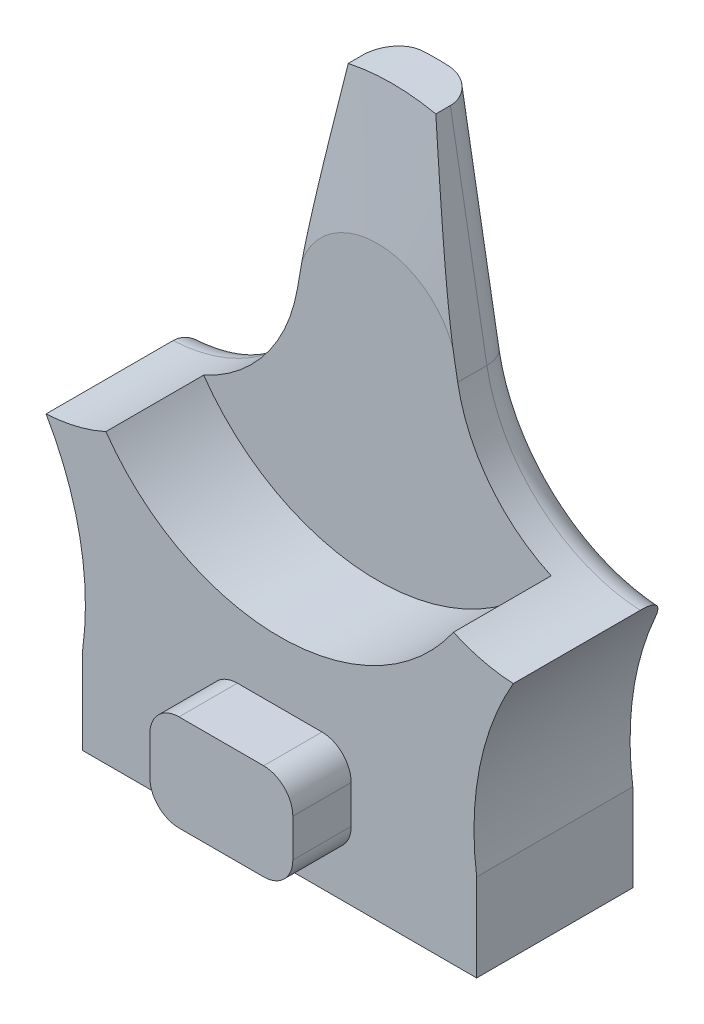
ISO-10303-21;
HEADER;
FILE_DESCRIPTION(('STEP AP214'),'2;1');
FILE_NAME('part.step','',(''),(''),'','','');
FILE_SCHEMA(('AUTOMOTIVE_DESIGN { 1 0 10303 214 1 1 1 1 }'));
ENDSEC;
DATA;
#1=APPLICATION_CONTEXT('core data for automotive mechanical design processes');
#2=APPLICATION_PROTOCOL_DEFINITION('international standard','automotive_design',2000,#1);
#3=PRODUCT_CONTEXT('',#1,'mechanical');
#4=PRODUCT('Part','Part','',(#3));
#5=PRODUCT_RELATED_PRODUCT_CATEGORY('part','',(#4));
#6=PRODUCT_DEFINITION_FORMATION('','',#4);
#7=PRODUCT_DEFINITION_CONTEXT('part definition',#1,'design');
#8=PRODUCT_DEFINITION('design','',#6,#7);
#9=PRODUCT_DEFINITION_SHAPE('','',#8);
#10=(LENGTH_UNIT() NAMED_UNIT(*) SI_UNIT(.MILLI.,.METRE.));
#11=(NAMED_UNIT(*) PLANE_ANGLE_UNIT() SI_UNIT($,.RADIAN.));
#12=(NAMED_UNIT(*) SI_UNIT($,.STERADIAN.) SOLID_ANGLE_UNIT());
#13=UNCERTAINTY_MEASURE_WITH_UNIT(LENGTH_MEASURE(1.E-05),#10,'distance_accuracy_value','');
#14=(GEOMETRIC_REPRESENTATION_CONTEXT(3) GLOBAL_UNCERTAINTY_ASSIGNED_CONTEXT((#13)) GLOBAL_UNIT_ASSIGNED_CONTEXT((#10,
#11,#12)) REPRESENTATION_CONTEXT('',''));
#15=CARTESIAN_POINT('',(0.,0.,0.));
#16=DIRECTION('',(0.,0.,1.));
#17=DIRECTION('',(1.,0.,0.));
#18=AXIS2_PLACEMENT_3D('',#15,#16,#17);
#19=CARTESIAN_POINT('',(5.95456315633577,-4.13590106472685,0.));
#20=DIRECTION('',(0.,0.,-1.));
#21=DIRECTION('',(-1.,0.,0.));
#22=AXIS2_PLACEMENT_3D('',#19,#20,#21);
#23=PLANE('',#22);
#24=CARTESIAN_POINT('',(-8.28795351713206,0.980518828013158,0.));
#25=DIRECTION('',(0.,0.,1.));
#26=DIRECTION('',(1.,0.,0.));
#27=AXIS2_PLACEMENT_3D('',#24,#25,#26);
#28=CIRCLE('',#27,5.62338537668215);
#29=CARTESIAN_POINT('',(-8.00453626127346,-4.63571992704029,0.));
#30=VERTEX_POINT('',#29);
#31=CARTESIAN_POINT('',(-5.95456315633577,-4.13590106472685,0.));
#32=VERTEX_POINT('',#31);
#33=EDGE_CURVE('E207',#30,#32,#28,.T.);
#34=ORIENTED_EDGE('',*,*,#33,.F.);
#35=CARTESIAN_POINT('',(-16.6580889761637,-9.64730903735411,0.));
#36=DIRECTION('',(0.,0.,-1.));
#37=DIRECTION('',(-1.,0.,0.));
#38=AXIS2_PLACEMENT_3D('',#35,#36,#37);
#39=CIRCLE('',#38,10.);
#40=CARTESIAN_POINT('',(-6.75,-11.,0.));
#41=VERTEX_POINT('',#40);
#42=EDGE_CURVE('E422',#41,#30,#39,.F.);
#43=ORIENTED_EDGE('',*,*,#42,.F.);
#44=DIRECTION('',(0.,1.,0.));
#45=VECTOR('',#44,1.);
#46=CARTESIAN_POINT('',(-6.75000000000001,-14.,0.));
#47=LINE('',#46,#45);
#48=CARTESIAN_POINT('',(-6.75000000000001,-14.,0.));
#49=VERTEX_POINT('',#48);
#50=EDGE_CURVE('E425',#49,#41,#47,.T.);
#51=ORIENTED_EDGE('',*,*,#50,.F.);
#52=DIRECTION('',(-1.,0.,0.));
#53=VECTOR('',#52,1.);
#54=CARTESIAN_POINT('',(6.75,-14.,0.));
#55=LINE('',#54,#53);
#56=CARTESIAN_POINT('',(6.75,-14.,0.));
#57=VERTEX_POINT('',#56);
#58=EDGE_CURVE('E416',#57,#49,#55,.T.);
#59=ORIENTED_EDGE('',*,*,#58,.F.);
#60=DIRECTION('',(0.,-1.,0.));
#61=VECTOR('',#60,1.);
#62=CARTESIAN_POINT('',(6.75,-11.,0.));
#63=LINE('',#62,#61);
#64=CARTESIAN_POINT('',(6.75,-11.,0.));
#65=VERTEX_POINT('',#64);
#66=EDGE_CURVE('E213',#65,#57,#63,.T.);
#67=ORIENTED_EDGE('',*,*,#66,.F.);
#68=CARTESIAN_POINT('',(16.6580889761637,-9.64730903735411,0.));
#69=DIRECTION('',(0.,0.,-1.));
#70=DIRECTION('',(-1.,0.,0.));
#71=AXIS2_PLACEMENT_3D('',#68,#69,#70);
#72=CIRCLE('',#71,10.);
#73=CARTESIAN_POINT('',(8.00453626127346,-4.63571992704029,0.));
#74=VERTEX_POINT('',#73);
#75=EDGE_CURVE('E210',#74,#65,#72,.F.);
#76=ORIENTED_EDGE('',*,*,#75,.F.);
#77=CARTESIAN_POINT('',(8.28795351713206,0.980518828013156,0.));
#78=DIRECTION('',(0.,0.,1.));
#79=DIRECTION('',(-1.,0.,0.));
#80=AXIS2_PLACEMENT_3D('',#77,#78,#79);
#81=CIRCLE('',#80,5.62338537668215);
#82=CARTESIAN_POINT('',(5.95456315633577,-4.13590106472685,0.));
#83=VERTEX_POINT('',#82);
#84=EDGE_CURVE('E198',#83,#74,#81,.T.);
#85=ORIENTED_EDGE('',*,*,#84,.F.);
#86=CARTESIAN_POINT('',(0.,0.,0.));
#87=DIRECTION('',(0.,0.,-1.));
#88=DIRECTION('',(-1.,0.,0.));
#89=AXIS2_PLACEMENT_3D('',#86,#87,#88);
#90=CIRCLE('',#89,7.25);
#91=EDGE_CURVE('E462',#32,#83,#90,.F.);
#92=ORIENTED_EDGE('',*,*,#91,.F.);
#93=EDGE_LOOP('',(#34,#43,#51,#59,#67,#76,#85,#92));
#94=FACE_BOUND('',#93,.T.);
#95=DIRECTION('',(0.,1.,0.));
#96=VECTOR('',#95,1.);
#97=CARTESIAN_POINT('',(2.45,-9.35,0.));
#98=LINE('',#97,#96);
#99=CARTESIAN_POINT('',(2.45,-11.65,0.));
#100=VERTEX_POINT('',#99);
#101=CARTESIAN_POINT('',(2.45,-10.35,0.));
#102=VERTEX_POINT('',#101);
#103=EDGE_CURVE('E504',#100,#102,#98,.T.);
#104=ORIENTED_EDGE('',*,*,#103,.F.);
#105=CARTESIAN_POINT('',(1.45,-11.65,0.));
#106=DIRECTION('',(0.,0.,-1.));
#107=DIRECTION('',(-1.,0.,0.));
#108=AXIS2_PLACEMENT_3D('',#105,#106,#107);
#109=CIRCLE('',#108,1.);
#110=CARTESIAN_POINT('',(1.45,-12.65,0.));
#111=VERTEX_POINT('',#110);
#112=EDGE_CURVE('E494',#100,#111,#109,.T.);
#113=ORIENTED_EDGE('',*,*,#112,.T.);
#114=DIRECTION('',(1.,0.,0.));
#115=VECTOR('',#114,1.);
#116=CARTESIAN_POINT('',(-2.45,-12.65,0.));
#117=LINE('',#116,#115);
#118=CARTESIAN_POINT('',(-1.45,-12.65,0.));
#119=VERTEX_POINT('',#118);
#120=EDGE_CURVE('E525',#119,#111,#117,.T.);
#121=ORIENTED_EDGE('',*,*,#120,.F.);
#122=CARTESIAN_POINT('',(-1.45,-11.65,0.));
#123=DIRECTION('',(0.,0.,-1.));
#124=DIRECTION('',(-1.,0.,0.));
#125=AXIS2_PLACEMENT_3D('',#122,#123,#124);
#126=CIRCLE('',#125,1.);
#127=CARTESIAN_POINT('',(-2.45,-11.65,0.));
#128=VERTEX_POINT('',#127);
#129=EDGE_CURVE('E11',#119,#128,#126,.T.);
#130=ORIENTED_EDGE('',*,*,#129,.T.);
#131=DIRECTION('',(0.,-1.,0.));
#132=VECTOR('',#131,1.);
#133=CARTESIAN_POINT('',(-2.45,-9.35,0.));
#134=LINE('',#133,#132);
#135=CARTESIAN_POINT('',(-2.45,-10.35,0.));
#136=VERTEX_POINT('',#135);
#137=EDGE_CURVE('E499',#136,#128,#134,.T.);
#138=ORIENTED_EDGE('',*,*,#137,.F.);
#139=CARTESIAN_POINT('',(-1.45,-10.35,0.));
#140=DIRECTION('',(0.,0.,-1.));
#141=DIRECTION('',(-1.,0.,0.));
#142=AXIS2_PLACEMENT_3D('',#139,#140,#141);
#143=CIRCLE('',#142,1.);
#144=CARTESIAN_POINT('',(-1.45,-9.35,0.));
#145=VERTEX_POINT('',#144);
#146=EDGE_CURVE('E45',#136,#145,#143,.T.);
#147=ORIENTED_EDGE('',*,*,#146,.T.);
#148=DIRECTION('',(-1.,0.,0.));
#149=VECTOR('',#148,1.);
#150=CARTESIAN_POINT('',(-2.45,-9.35,0.));
#151=LINE('',#150,#149);
#152=CARTESIAN_POINT('',(1.45,-9.35,0.));
#153=VERTEX_POINT('',#152);
#154=EDGE_CURVE('E498',#153,#145,#151,.T.);
#155=ORIENTED_EDGE('',*,*,#154,.F.);
#156=CARTESIAN_POINT('',(1.45,-10.35,0.));
#157=DIRECTION('',(0.,0.,-1.));
#158=DIRECTION('',(-1.,0.,0.));
#159=AXIS2_PLACEMENT_3D('',#156,#157,#158);
#160=CIRCLE('',#159,1.);
#161=EDGE_CURVE('E492',#153,#102,#160,.T.);
#162=ORIENTED_EDGE('',*,*,#161,.T.);
#163=EDGE_LOOP('',(#104,#113,#121,#130,#138,#147,#155,#162));
#164=FACE_BOUND('',#163,.T.);
#165=ADVANCED_FACE('F37',(#94,#164),#23,.F.);
#166=CARTESIAN_POINT('',(8.28795351713206,0.980518828013156,-3.35));
#167=DIRECTION('',(0.,0.,1.));
#168=DIRECTION('',(1.,0.,0.));
#169=AXIS2_PLACEMENT_3D('',#166,#167,#168);
#170=PLANE('',#169);
#171=CARTESIAN_POINT('',(-8.28795351713206,0.980518828013158,-3.35));
#172=DIRECTION('',(0.,0.,1.));
#173=DIRECTION('',(-1.,0.,0.));
#174=AXIS2_PLACEMENT_3D('',#171,#172,#173);
#175=CIRCLE('',#174,5.62338537668215);
#176=CARTESIAN_POINT('',(-5.95456315633577,-4.13590106472685,-3.35));
#177=VERTEX_POINT('',#176);
#178=CARTESIAN_POINT('',(-2.75,0.00402820503343662,-3.35));
#179=VERTEX_POINT('',#178);
#180=EDGE_CURVE('E391',#177,#179,#175,.T.);
#181=ORIENTED_EDGE('',*,*,#180,.F.);
#182=CARTESIAN_POINT('',(0.,0.,-3.35));
#183=DIRECTION('',(0.,0.,1.));
#184=DIRECTION('',(1.,0.,0.));
#185=AXIS2_PLACEMENT_3D('',#182,#183,#184);
#186=CIRCLE('',#185,7.25);
#187=CARTESIAN_POINT('',(5.95456315633577,-4.13590106472685,-3.35));
#188=VERTEX_POINT('',#187);
#189=EDGE_CURVE('E433',#188,#177,#186,.F.);
#190=ORIENTED_EDGE('',*,*,#189,.F.);
#191=CARTESIAN_POINT('',(8.28795351713206,0.980518828013156,-3.35));
#192=DIRECTION('',(0.,0.,1.));
#193=DIRECTION('',(1.,0.,0.));
#194=AXIS2_PLACEMENT_3D('',#191,#192,#193);
#195=CIRCLE('',#194,5.62338537668215);
#196=CARTESIAN_POINT('',(2.75,0.00402820503343435,-3.35));
#197=VERTEX_POINT('',#196);
#198=EDGE_CURVE('E449',#197,#188,#195,.T.);
#199=ORIENTED_EDGE('',*,*,#198,.F.);
#200=DIRECTION('',(0.173648177666931,-0.984807753012208,0.));
#201=VECTOR('',#200,1.);
#202=CARTESIAN_POINT('',(1.5,7.09313047955555,-3.35));
#203=LINE('',#202,#201);
#204=CARTESIAN_POINT('',(2.58553540945316,0.936753247372591,-3.35));
#205=VERTEX_POINT('',#204);
#206=EDGE_CURVE('E386',#205,#197,#203,.T.);
#207=ORIENTED_EDGE('',*,*,#206,.F.);
#208=CARTESIAN_POINT('',(0.,0.,-3.35));
#209=DIRECTION('',(0.,0.,1.));
#210=DIRECTION('',(1.,0.,0.));
#211=AXIS2_PLACEMENT_3D('',#208,#209,#210);
#212=CIRCLE('',#211,2.74999999999986);
#213=CARTESIAN_POINT('',(-2.58553540945316,0.936753247372578,-3.35));
#214=VERTEX_POINT('',#213);
#215=EDGE_CURVE('E239',#205,#214,#212,.T.);
#216=ORIENTED_EDGE('',*,*,#215,.T.);
#217=DIRECTION('',(0.173648177666931,0.984807753012208,0.));
#218=VECTOR('',#217,1.);
#219=CARTESIAN_POINT('',(-1.5,7.09313047955555,-3.35));
#220=LINE('',#219,#218);
#221=EDGE_CURVE('E383',#179,#214,#220,.T.);
#222=ORIENTED_EDGE('',*,*,#221,.F.);
#223=EDGE_LOOP('',(#181,#190,#199,#207,#216,#222));
#224=FACE_BOUND('',#223,.T.);
#225=ADVANCED_FACE('F253',(#224),#170,.T.);
#226=CARTESIAN_POINT('',(8.28795351713206,0.980518828013156,-5.35));
#227=DIRECTION('',(0.,0.,1.));
#228=DIRECTION('',(1.,0.,0.));
#229=AXIS2_PLACEMENT_3D('',#226,#227,#228);
#230=CYLINDRICAL_SURFACE('',#229,5.62338537668215);
#231=DIRECTION('',(0.,0.,1.));
#232=VECTOR('',#231,1.);
#233=CARTESIAN_POINT('',(8.00453626127346,-4.63571992704029,-5.35));
#234=LINE('',#233,#232);
#235=CARTESIAN_POINT('',(8.00453626127346,-4.63571992704029,-4.35));
#236=VERTEX_POINT('',#235);
#237=EDGE_CURVE('E202',#236,#74,#234,.T.);
#238=ORIENTED_EDGE('',*,*,#237,.F.);
#239=CARTESIAN_POINT('',(8.28795351713206,0.980518828013156,-4.35));
#240=DIRECTION('',(0.,0.,1.));
#241=DIRECTION('',(1.,0.,0.));
#242=AXIS2_PLACEMENT_3D('',#239,#240,#241);
#243=CIRCLE('',#242,5.62338537668215);
#244=CARTESIAN_POINT('',(2.75,0.00402820503343435,-4.35));
#245=VERTEX_POINT('',#244);
#246=EDGE_CURVE('E297',#236,#245,#243,.F.);
#247=ORIENTED_EDGE('',*,*,#246,.T.);
#248=DIRECTION('',(0.,0.,1.));
#249=VECTOR('',#248,1.);
#250=CARTESIAN_POINT('',(2.75,0.00402820503343435,-5.35));
#251=LINE('',#250,#249);
#252=EDGE_CURVE('E354',#245,#197,#251,.T.);
#253=ORIENTED_EDGE('',*,*,#252,.T.);
#254=ORIENTED_EDGE('',*,*,#198,.T.);
#255=DIRECTION('',(0.,0.,1.));
#256=VECTOR('',#255,1.);
#257=CARTESIAN_POINT('',(5.95456315633577,-4.13590106472685,-22.1540115623508));
#258=LINE('',#257,#256);
#259=EDGE_CURVE('E205',#188,#83,#258,.T.);
#260=ORIENTED_EDGE('',*,*,#259,.T.);
#261=ORIENTED_EDGE('',*,*,#84,.T.);
#262=EDGE_LOOP('',(#238,#247,#253,#254,#260,#261));
#263=FACE_BOUND('',#262,.T.);
#264=ADVANCED_FACE('F200',(#263),#230,.F.);
#265=CARTESIAN_POINT('',(16.6580889761637,-9.64730903735411,-5.35));
#266=DIRECTION('',(0.,0.,1.));
#267=DIRECTION('',(1.,0.,0.));
#268=AXIS2_PLACEMENT_3D('',#265,#266,#267);
#269=CYLINDRICAL_SURFACE('',#268,10.);
#270=ORIENTED_EDGE('',*,*,#237,.T.);
#271=ORIENTED_EDGE('',*,*,#75,.T.);
#272=DIRECTION('',(0.,0.,1.));
#273=VECTOR('',#272,1.);
#274=CARTESIAN_POINT('',(6.75,-11.,-5.35));
#275=LINE('',#274,#273);
#276=CARTESIAN_POINT('',(6.75,-11.,-5.35));
#277=VERTEX_POINT('',#276);
#278=EDGE_CURVE('E224',#277,#65,#275,.T.);
#279=ORIENTED_EDGE('',*,*,#278,.F.);
#280=CARTESIAN_POINT('',(16.6580889761637,-9.64730903735411,-5.35));
#281=DIRECTION('',(0.,0.,1.));
#282=DIRECTION('',(-1.,0.,0.));
#283=AXIS2_PLACEMENT_3D('',#280,#281,#282);
#284=CIRCLE('',#283,10.);
#285=CARTESIAN_POINT('',(7.51479933973998,-5.59758625369755,-5.35));
#286=VERTEX_POINT('',#285);
#287=EDGE_CURVE('E441',#286,#277,#284,.T.);
#288=ORIENTED_EDGE('',*,*,#287,.F.);
#289=CARTESIAN_POINT('',(7.51479933973998,-5.59758625369755,-5.35));
#290=CARTESIAN_POINT('',(7.54022716452608,-5.54012191831414,-5.35003053324127));
#291=CARTESIAN_POINT('',(7.56621607815371,-5.48296077839916,-5.34459620255802));
#292=CARTESIAN_POINT('',(7.61845289958684,-5.37078160024852,-5.32333948378299));
#293=CARTESIAN_POINT('',(7.64470055949943,-5.31576172133951,-5.30752623634775));
#294=CARTESIAN_POINT('',(7.69663144250522,-5.20931172203515,-5.26605786098633));
#295=CARTESIAN_POINT('',(7.72231483550598,-5.15788051061067,-5.24040573982579));
#296=CARTESIAN_POINT('',(7.77221525389835,-5.05990620895944,-5.17992405769295));
#297=CARTESIAN_POINT('',(7.79643190586038,-5.01336436135889,-5.14509217154799));
#298=CARTESIAN_POINT('',(7.84255065265496,-4.92621425936311,-5.0667462808639));
#299=CARTESIAN_POINT('',(7.86443590144804,-4.88564847388685,-5.02317488806157));
#300=CARTESIAN_POINT('',(7.90457731363263,-4.81225090669501,-4.92845238616487));
#301=CARTESIAN_POINT('',(7.92283404547694,-4.779417913391,-4.87730246653703));
#302=CARTESIAN_POINT('',(7.95354507703231,-4.72472416697454,-4.77215082629554));
#303=CARTESIAN_POINT('',(7.9662891169956,-4.70230901670014,-4.71852297525032));
#304=CARTESIAN_POINT('',(7.98659985448402,-4.6667765421437,-4.60740112703006));
#305=CARTESIAN_POINT('',(7.99417878836557,-4.65363724031045,-4.54991662415363));
#306=CARTESIAN_POINT('',(8.00075197178131,-4.64225896677644,-4.46816804560544));
#307=CARTESIAN_POINT('',(8.00216937435166,-4.6398086569338,-4.44461184644839));
#308=CARTESIAN_POINT('',(8.00406101401724,-4.63654033676122,-4.39737513395148));
#309=CARTESIAN_POINT('',(8.00453629305024,-4.63572052318708,-4.37369478701749));
#310=CARTESIAN_POINT('',(8.00453626127346,-4.63571992704029,-4.35));
#311=B_SPLINE_CURVE_WITH_KNOTS('',3,(#289,#290,#291,#292,#293,#294,#295,#296,#297,#298,#299,
#300,#301,#302,#303,#304,#305,#306,#307,#308,#309,#310),.UNSPECIFIED.,.F.,.F.,(4,2,2,2,2,2,2,2,
2,2,4),(0.,0.188209246705387,0.376252960545998,0.564239253844848,0.752273208646291,
0.941584889158994,1.13086688819894,1.30840439661612,1.48551983526486,1.55663554634912,
1.62767256331688),.UNSPECIFIED.);
#312=EDGE_CURVE('E222',#286,#236,#311,.T.);
#313=ORIENTED_EDGE('',*,*,#312,.T.);
#314=EDGE_LOOP('',(#270,#271,#279,#288,#313));
#315=FACE_BOUND('',#314,.T.);
#316=ADVANCED_FACE('F219',(#315),#269,.F.);
#317=CARTESIAN_POINT('',(6.75,-11.,-5.35));
#318=DIRECTION('',(-1.,0.,0.));
#319=DIRECTION('',(0.,0.,1.));
#320=AXIS2_PLACEMENT_3D('',#317,#318,#319);
#321=PLANE('',#320);
#322=ORIENTED_EDGE('',*,*,#278,.T.);
#323=ORIENTED_EDGE('',*,*,#66,.T.);
#324=DIRECTION('',(0.,0.,1.));
#325=VECTOR('',#324,1.);
#326=CARTESIAN_POINT('',(6.75,-14.,-5.35));
#327=LINE('',#326,#325);
#328=CARTESIAN_POINT('',(6.75,-14.,-5.35));
#329=VERTEX_POINT('',#328);
#330=EDGE_CURVE('E229',#329,#57,#327,.T.);
#331=ORIENTED_EDGE('',*,*,#330,.F.);
#332=DIRECTION('',(0.,-1.,0.));
#333=VECTOR('',#332,1.);
#334=CARTESIAN_POINT('',(6.75,-11.,-5.35));
#335=LINE('',#334,#333);
#336=EDGE_CURVE('E421',#277,#329,#335,.T.);
#337=ORIENTED_EDGE('',*,*,#336,.F.);
#338=EDGE_LOOP('',(#322,#323,#331,#337));
#339=FACE_BOUND('',#338,.T.);
#340=ADVANCED_FACE('F307',(#339),#321,.F.);
#341=CARTESIAN_POINT('',(6.75,-14.,-5.35));
#342=DIRECTION('',(0.,1.,0.));
#343=DIRECTION('',(-1.,0.,0.));
#344=AXIS2_PLACEMENT_3D('',#341,#342,#343);
#345=PLANE('',#344);
#346=ORIENTED_EDGE('',*,*,#58,.T.);
#347=DIRECTION('',(0.,0.,1.));
#348=VECTOR('',#347,1.);
#349=CARTESIAN_POINT('',(-6.75000000000001,-14.,-5.35));
#350=LINE('',#349,#348);
#351=CARTESIAN_POINT('',(-6.75000000000001,-14.,-5.35));
#352=VERTEX_POINT('',#351);
#353=EDGE_CURVE('E408',#352,#49,#350,.T.);
#354=ORIENTED_EDGE('',*,*,#353,.F.);
#355=DIRECTION('',(-1.,0.,0.));
#356=VECTOR('',#355,1.);
#357=CARTESIAN_POINT('',(6.75,-14.,-5.35));
#358=LINE('',#357,#356);
#359=EDGE_CURVE('E418',#329,#352,#358,.T.);
#360=ORIENTED_EDGE('',*,*,#359,.F.);
#361=ORIENTED_EDGE('',*,*,#330,.T.);
#362=EDGE_LOOP('',(#346,#354,#360,#361));
#363=FACE_BOUND('',#362,.T.);
#364=ADVANCED_FACE('F414',(#363),#345,.F.);
#365=CARTESIAN_POINT('',(-6.75000000000001,-11.,-5.35));
#366=DIRECTION('',(1.,0.,0.));
#367=DIRECTION('',(0.,0.,-1.));
#368=AXIS2_PLACEMENT_3D('',#365,#366,#367);
#369=PLANE('',#368);
#370=ORIENTED_EDGE('',*,*,#353,.T.);
#371=ORIENTED_EDGE('',*,*,#50,.T.);
#372=DIRECTION('',(0.,0.,1.));
#373=VECTOR('',#372,1.);
#374=CARTESIAN_POINT('',(-6.75000000000001,-11.,-5.35));
#375=LINE('',#374,#373);
#376=CARTESIAN_POINT('',(-6.75000000000001,-11.,-5.35));
#377=VERTEX_POINT('',#376);
#378=EDGE_CURVE('E405',#377,#41,#375,.T.);
#379=ORIENTED_EDGE('',*,*,#378,.F.);
#380=DIRECTION('',(0.,1.,0.));
#381=VECTOR('',#380,1.);
#382=CARTESIAN_POINT('',(-6.75000000000001,-11.,-5.35));
#383=LINE('',#382,#381);
#384=EDGE_CURVE('E445',#352,#377,#383,.T.);
#385=ORIENTED_EDGE('',*,*,#384,.F.);
#386=EDGE_LOOP('',(#370,#371,#379,#385));
#387=FACE_BOUND('',#386,.T.);
#388=ADVANCED_FACE('F695',(#387),#369,.F.);
#389=CARTESIAN_POINT('',(-16.6580889761637,-9.64730903735411,-5.35));
#390=DIRECTION('',(0.,0.,1.));
#391=DIRECTION('',(1.,0.,0.));
#392=AXIS2_PLACEMENT_3D('',#389,#390,#391);
#393=CYLINDRICAL_SURFACE('',#392,10.);
#394=ORIENTED_EDGE('',*,*,#378,.T.);
#395=ORIENTED_EDGE('',*,*,#42,.T.);
#396=DIRECTION('',(0.,0.,1.));
#397=VECTOR('',#396,1.);
#398=CARTESIAN_POINT('',(-8.00453626127346,-4.63571992704029,-5.35));
#399=LINE('',#398,#397);
#400=CARTESIAN_POINT('',(-8.00453626127346,-4.63571992704029,-4.35));
#401=VERTEX_POINT('',#400);
#402=EDGE_CURVE('E398',#401,#30,#399,.T.);
#403=ORIENTED_EDGE('',*,*,#402,.F.);
#404=CARTESIAN_POINT('',(-8.00453626127346,-4.63571992704029,-4.35));
#405=CARTESIAN_POINT('',(-8.00453792682807,-4.63571836511069,-4.37616651670688));
#406=CARTESIAN_POINT('',(-8.00395713378718,-4.63671978470011,-4.4023192376121));
#407=CARTESIAN_POINT('',(-8.00165161655391,-4.64070337794556,-4.45441318401899));
#408=CARTESIAN_POINT('',(-7.99992731218761,-4.64368482465965,-4.48035448360442));
#409=CARTESIAN_POINT('',(-7.99309338181528,-4.65552192738227,-4.55735033432688));
#410=CARTESIAN_POINT('',(-7.98632227082337,-4.66727094192228,-4.60784866638888));
#411=CARTESIAN_POINT('',(-7.96879134816964,-4.69792392573712,-4.7057821635489));
#412=CARTESIAN_POINT('',(-7.95803560436905,-4.71682059847005,-4.75322039487483));
#413=CARTESIAN_POINT('',(-7.93313318138352,-4.76102328003758,-4.84408352057089));
#414=CARTESIAN_POINT('',(-7.91898338875691,-4.78633517492216,-4.88750467901022));
#415=CARTESIAN_POINT('',(-7.88709842850057,-4.84409456516479,-4.97174647159879));
#416=CARTESIAN_POINT('',(-7.86920804033258,-4.87685972676381,-5.0122897013677));
#417=CARTESIAN_POINT('',(-7.83114944965847,-4.94765436513428,-5.08724519209562));
#418=CARTESIAN_POINT('',(-7.81098035806448,-4.98568589801507,-5.12165504638745));
#419=CARTESIAN_POINT('',(-7.76699544381422,-5.07009006241112,-5.18684588637972));
#420=CARTESIAN_POINT('',(-7.74301623683708,-5.11691563240588,-5.21693142947587));
#421=CARTESIAN_POINT('',(-7.69402456076681,-5.21464188210541,-5.26835272215866));
#422=CARTESIAN_POINT('',(-7.66901222658358,-5.26554203054457,-5.28968961022859));
#423=CARTESIAN_POINT('',(-7.62223029983851,-5.36294823588561,-5.32074367399597));
#424=CARTESIAN_POINT('',(-7.60049023447476,-5.40908951406149,-5.33165910936188));
#425=CARTESIAN_POINT('',(-7.5573078201046,-5.50261501827141,-5.34629285025595));
#426=CARTESIAN_POINT('',(-7.53586538632799,-5.54999887880851,-5.35001324861195));
#427=CARTESIAN_POINT('',(-7.51479933973999,-5.59758625369754,-5.35));
#428=B_SPLINE_CURVE_WITH_KNOTS('',3,(#404,#405,#406,#407,#408,#409,#410,#411,#412,#413,#414,
#415,#416,#417,#418,#419,#420,#421,#422,#423,#424,#425,#426,#427),.UNSPECIFIED.,.F.,.F.,(4,2,2,
2,2,2,2,2,2,2,2,4),(0.,0.0784472083010385,0.156865631610082,0.31289818546632,0.46877188465971,
0.624789121042317,0.789451161606903,0.954177672135917,1.13519527921175,1.31618932255387,
1.47217208404999,1.62810946785148),.UNSPECIFIED.);
#429=CARTESIAN_POINT('',(-7.51479933973999,-5.59758625369754,-5.35));
#430=VERTEX_POINT('',#429);
#431=EDGE_CURVE('E298',#401,#430,#428,.T.);
#432=ORIENTED_EDGE('',*,*,#431,.T.);
#433=CARTESIAN_POINT('',(-16.6580889761637,-9.64730903735411,-5.35));
#434=DIRECTION('',(0.,0.,1.));
#435=DIRECTION('',(1.,0.,0.));
#436=AXIS2_PLACEMENT_3D('',#433,#434,#435);
#437=CIRCLE('',#436,10.);
#438=EDGE_CURVE('E355',#377,#430,#437,.T.);
#439=ORIENTED_EDGE('',*,*,#438,.F.);
#440=EDGE_LOOP('',(#394,#395,#403,#432,#439));
#441=FACE_BOUND('',#440,.T.);
#442=ADVANCED_FACE('F686',(#441),#393,.F.);
#443=CARTESIAN_POINT('',(-8.28795351713206,0.980518828013158,-5.35));
#444=DIRECTION('',(0.,0.,1.));
#445=DIRECTION('',(1.,0.,0.));
#446=AXIS2_PLACEMENT_3D('',#443,#444,#445);
#447=CYLINDRICAL_SURFACE('',#446,5.62338537668215);
#448=DIRECTION('',(0.,0.,1.));
#449=VECTOR('',#448,1.);
#450=CARTESIAN_POINT('',(-2.75,0.00402820503343662,-5.35));
#451=LINE('',#450,#449);
#452=CARTESIAN_POINT('',(-2.75,0.00402820503343662,-4.35));
#453=VERTEX_POINT('',#452);
#454=EDGE_CURVE('E390',#453,#179,#451,.T.);
#455=ORIENTED_EDGE('',*,*,#454,.F.);
#456=CARTESIAN_POINT('',(-8.28795351713206,0.980518828013158,-4.35));
#457=DIRECTION('',(0.,0.,1.));
#458=DIRECTION('',(1.,0.,0.));
#459=AXIS2_PLACEMENT_3D('',#456,#457,#458);
#460=CIRCLE('',#459,5.62338537668215);
#461=EDGE_CURVE('E276',#453,#401,#460,.F.);
#462=ORIENTED_EDGE('',*,*,#461,.T.);
#463=ORIENTED_EDGE('',*,*,#402,.T.);
#464=ORIENTED_EDGE('',*,*,#33,.T.);
#465=DIRECTION('',(0.,0.,1.));
#466=VECTOR('',#465,1.);
#467=CARTESIAN_POINT('',(-5.95456315633577,-4.13590106472685,-22.1540115623508));
#468=LINE('',#467,#466);
#469=EDGE_CURVE('E439',#177,#32,#468,.T.);
#470=ORIENTED_EDGE('',*,*,#469,.F.);
#471=ORIENTED_EDGE('',*,*,#180,.T.);
#472=EDGE_LOOP('',(#455,#462,#463,#464,#470,#471));
#473=FACE_BOUND('',#472,.T.);
#474=ADVANCED_FACE('F665',(#473),#447,.F.);
#475=CARTESIAN_POINT('',(-1.5,7.09313047955555,-5.35));
#476=DIRECTION('',(0.984807753012208,-0.173648177666931,0.));
#477=DIRECTION('',(0.173648177666931,0.984807753012208,0.));
#478=AXIS2_PLACEMENT_3D('',#475,#476,#477);
#479=PLANE('',#478);
#480=DIRECTION('',(0.,0.,1.));
#481=VECTOR('',#480,1.);
#482=CARTESIAN_POINT('',(-1.5,7.09313047955555,-5.35));
#483=LINE('',#482,#481);
#484=CARTESIAN_POINT('',(-1.5,7.09313047955555,-4.35));
#485=VERTEX_POINT('',#484);
#486=CARTESIAN_POINT('',(-1.5,7.09313047955555,-3.85));
#487=VERTEX_POINT('',#486);
#488=EDGE_CURVE('E395',#485,#487,#483,.T.);
#489=ORIENTED_EDGE('',*,*,#488,.F.);
#490=DIRECTION('',(0.173648177666931,0.984807753012208,0.));
#491=VECTOR('',#490,1.);
#492=CARTESIAN_POINT('',(-1.5,7.09313047955555,-4.35));
#493=LINE('',#492,#491);
#494=EDGE_CURVE('E465',#485,#453,#493,.F.);
#495=ORIENTED_EDGE('',*,*,#494,.T.);
#496=ORIENTED_EDGE('',*,*,#454,.T.);
#497=ORIENTED_EDGE('',*,*,#221,.T.);
#498=CARTESIAN_POINT('',(-2.58553540945316,0.936753247372578,-3.35));
#499=CARTESIAN_POINT('',(-2.54557096397191,1.16340288046152,-3.35436565977991));
#500=CARTESIAN_POINT('',(-2.5056232281683,1.38995774825944,-3.36194369505096));
#501=CARTESIAN_POINT('',(-2.4257739078636,1.84280574681227,-3.38211869289228));
#502=CARTESIAN_POINT('',(-2.38587231514388,2.06909892417746,-3.39471455113662));
#503=CARTESIAN_POINT('',(-2.30612354650351,2.52137666590447,-3.42351778882575));
#504=CARTESIAN_POINT('',(-2.26627635700065,2.74736130729491,-3.43972397896291));
#505=CARTESIAN_POINT('',(-2.18661235996356,3.19915828536943,-3.47460391175504));
#506=CARTESIAN_POINT('',(-2.14679555457551,3.42497060988192,-3.4932778149401));
#507=CARTESIAN_POINT('',(-2.05636572705399,3.93782364665589,-3.53760552608596));
#508=CARTESIAN_POINT('',(-2.00576044206742,4.22482047937681,-3.56377673637889));
#509=CARTESIAN_POINT('',(-1.9045785637631,4.79865142627884,-3.61781407250103));
#510=CARTESIAN_POINT('',(-1.854001969857,5.08548554379668,-3.64568016220492));
#511=CARTESIAN_POINT('',(-1.7528470730098,5.65916347125155,-3.70252875859127));
#512=CARTESIAN_POINT('',(-1.70226877771085,5.94600723784771,-3.73151171392314));
#513=CARTESIAN_POINT('',(-1.60112559861815,6.51961871061447,-3.79025498672304));
#514=CARTESIAN_POINT('',(-1.55056071487144,6.8063864165183,-3.82001530688216));
#515=CARTESIAN_POINT('',(-1.5,7.09313047955555,-3.85));
#516=B_SPLINE_CURVE_WITH_KNOTS('',3,(#498,#499,#500,#501,#502,#503,#504,#505,#506,#507,#508,
#509,#510,#511,#512,#513,#514,#515),.UNSPECIFIED.,.F.,.F.,(4,2,2,2,2,2,2,2,4),(0.,
0.69048974960349,1.38082761962388,2.07093841544226,2.76109412658772,3.63887695367392,
4.51664107791236,5.3947615562888,6.27288507495234),.UNSPECIFIED.);
#517=EDGE_CURVE('E369',#214,#487,#516,.T.);
#518=ORIENTED_EDGE('',*,*,#517,.T.);
#519=EDGE_LOOP('',(#489,#495,#496,#497,#518));
#520=FACE_BOUND('',#519,.T.);
#521=ADVANCED_FACE('F258',(#520),#479,.F.);
#522=CARTESIAN_POINT('',(0.,0.,-5.35));
#523=DIRECTION('',(0.,0.,1.));
#524=DIRECTION('',(1.,0.,0.));
#525=AXIS2_PLACEMENT_3D('',#522,#523,#524);
#526=CYLINDRICAL_SURFACE('',#525,7.25);
#527=DIRECTION('',(0.,0.,1.));
#528=VECTOR('',#527,1.);
#529=CARTESIAN_POINT('',(1.5,7.09313047955555,-5.35));
#530=LINE('',#529,#528);
#531=CARTESIAN_POINT('',(1.5,7.09313047955555,-4.35));
#532=VERTEX_POINT('',#531);
#533=CARTESIAN_POINT('',(1.5,7.09313047955555,-3.85));
#534=VERTEX_POINT('',#533);
#535=EDGE_CURVE('E394',#532,#534,#530,.T.);
#536=ORIENTED_EDGE('',*,*,#535,.F.);
#537=CARTESIAN_POINT('',(1.5,7.09313047955555,-4.35));
#538=CARTESIAN_POINT('',(1.50000110026365,7.09312930966192,-4.37682570489543));
#539=CARTESIAN_POINT('',(1.49886067208606,7.09337151135871,-4.40363779431569));
#540=CARTESIAN_POINT('',(1.49431960674133,7.09432991701994,-4.45705479632839));
#541=CARTESIAN_POINT('',(1.49091952904272,7.09504600365463,-4.48365975855441));
#542=CARTESIAN_POINT('',(1.47739903932761,7.09787866941234,-4.56270473624169));
#543=CARTESIAN_POINT('',(1.46395795161784,7.10067986051307,-4.6145901549626));
#544=CARTESIAN_POINT('',(1.42877410412298,7.1078422744004,-4.71527735271097));
#545=CARTESIAN_POINT('',(1.40703520396548,7.11220277183495,-4.76408055311363));
#546=CARTESIAN_POINT('',(1.35604903146707,7.12209965243463,-4.85748512505765));
#547=CARTESIAN_POINT('',(1.32679765191088,7.12763667854352,-4.90208417982108));
#548=CARTESIAN_POINT('',(1.26053350665902,7.1396587452435,-4.9876193207779));
#549=CARTESIAN_POINT('',(1.22327551274579,7.14617109933474,-5.02836117307837));
#550=CARTESIAN_POINT('',(1.14279817246222,7.15948146596825,-5.10340866341385));
#551=CARTESIAN_POINT('',(1.09957666011076,7.16627958167399,-5.1377119521951));
#552=CARTESIAN_POINT('',(1.00542870041632,7.18011231123223,-5.20111633580122));
#553=CARTESIAN_POINT('',(0.954188722715665,7.18713493411761,-5.2297549476698));
#554=CARTESIAN_POINT('',(0.847645323418738,7.20047758766285,-5.27827517659945));
#555=CARTESIAN_POINT('',(0.792343225165682,7.20679784546537,-5.29815963092473));
#556=CARTESIAN_POINT('',(0.690815332320007,7.21715379246081,-5.32548417162212));
#557=CARTESIAN_POINT('',(0.64506563295909,7.22139191927463,-5.3346436750441));
#558=CARTESIAN_POINT('',(0.552723622644381,7.22905101021555,-5.34690505278701));
#559=CARTESIAN_POINT('',(0.506131815850861,7.23247244692151,-5.35001043782524));
#560=CARTESIAN_POINT('',(0.459483019787692,7.2354250292935,-5.35));
#561=B_SPLINE_CURVE_WITH_KNOTS('',3,(#537,#538,#539,#540,#541,#542,#543,#544,#545,#546,#547,
#548,#549,#550,#551,#552,#553,#554,#555,#556,#557,#558,#559,#560),.UNSPECIFIED.,.F.,.F.,(4,2,2,
2,2,2,2,2,2,2,2,4),(0.,0.080425159323922,0.160830413529382,0.321003598917913,0.481102372286044,
0.641288861719493,0.807348026198744,0.973467663787675,1.15002831997083,1.32653170980009,
1.46668810125658,1.606763193345),.UNSPECIFIED.);
#562=CARTESIAN_POINT('',(0.459483019787692,7.2354250292935,-5.35));
#563=VERTEX_POINT('',#562);
#564=EDGE_CURVE('E271',#532,#563,#561,.T.);
#565=ORIENTED_EDGE('',*,*,#564,.T.);
#566=CARTESIAN_POINT('',(0.,0.,-5.35));
#567=DIRECTION('',(0.,0.,-1.));
#568=DIRECTION('',(-1.,0.,0.));
#569=AXIS2_PLACEMENT_3D('',#566,#567,#568);
#570=CIRCLE('',#569,7.25);
#571=CARTESIAN_POINT('',(-0.459483019787695,7.2354250292935,-5.35));
#572=VERTEX_POINT('',#571);
#573=EDGE_CURVE('E347',#572,#563,#570,.T.);
#574=ORIENTED_EDGE('',*,*,#573,.F.);
#575=CARTESIAN_POINT('',(-0.459483019787695,7.2354250292935,-5.35));
#576=CARTESIAN_POINT('',(-0.519469219619517,7.23164359823568,-5.35003509300639));
#577=CARTESIAN_POINT('',(-0.579364275611573,7.22706388459768,-5.34488452519779));
#578=CARTESIAN_POINT('',(-0.697292794974427,7.21662494274921,-5.32468794520405));
#579=CARTESIAN_POINT('',(-0.755328008960328,7.21076696088161,-5.30965154340134));
#580=CARTESIAN_POINT('',(-0.867973378786522,7.19808075837272,-5.27015984560637));
#581=CARTESIAN_POINT('',(-0.92258395392424,7.19125265684415,-5.24570570530822));
#582=CARTESIAN_POINT('',(-1.026905291484,7.17709768990133,-5.18803438378136));
#583=CARTESIAN_POINT('',(-1.07661546740882,7.16977076496309,-5.15481615538023));
#584=CARTESIAN_POINT('',(-1.17001516209996,7.15512543004427,-5.08014057667807));
#585=CARTESIAN_POINT('',(-1.21365948296932,7.14780744895598,-5.0386264662653));
#586=CARTESIAN_POINT('',(-1.2930583799267,7.13387191866129,-4.94850563307946));
#587=CARTESIAN_POINT('',(-1.32881304654379,7.12725436141841,-4.89989899169957));
#588=CARTESIAN_POINT('',(-1.38988610490065,7.11559212277542,-4.79880678937305));
#589=CARTESIAN_POINT('',(-1.41554030767813,7.11049849674747,-4.74652996640973));
#590=CARTESIAN_POINT('',(-1.45710829419341,7.10209767666614,-4.63813870747733));
#591=CARTESIAN_POINT('',(-1.47303763574934,7.09878763024609,-4.58203056161674));
#592=CARTESIAN_POINT('',(-1.48913919690871,7.09542047889718,-4.49612467434293));
#593=CARTESIAN_POINT('',(-1.49320810754536,7.0945642039475,-4.46704080608984));
#594=CARTESIAN_POINT('',(-1.49863780742992,7.09341866995179,-4.40864364301281));
#595=CARTESIAN_POINT('',(-1.50000164769167,7.09312877210191,-4.37933064414424));
#596=CARTESIAN_POINT('',(-1.5,7.09313047955555,-4.35));
#597=B_SPLINE_CURVE_WITH_KNOTS('',3,(#575,#576,#577,#578,#579,#580,#581,#582,#583,#584,#585,
#586,#587,#588,#589,#590,#591,#592,#593,#594,#595,#596),.UNSPECIFIED.,.F.,.F.,(4,2,2,2,2,2,2,2,
2,2,4),(0.,0.180033526253308,0.35989229357369,0.539728996624959,0.7195871971084,
0.900720929227586,1.0818525828372,1.25631449446089,1.43049656575469,1.51852036509408,
1.60644482694475),.UNSPECIFIED.);
#598=EDGE_CURVE('E264',#572,#485,#597,.T.);
#599=ORIENTED_EDGE('',*,*,#598,.T.);
#600=ORIENTED_EDGE('',*,*,#488,.T.);
#601=CARTESIAN_POINT('',(0.,0.,-3.85));
#602=DIRECTION('',(0.,0.,1.));
#603=DIRECTION('',(1.,0.,0.));
#604=AXIS2_PLACEMENT_3D('',#601,#602,#603);
#605=CIRCLE('',#604,7.25);
#606=EDGE_CURVE('E223',#487,#534,#605,.F.);
#607=ORIENTED_EDGE('',*,*,#606,.T.);
#608=EDGE_LOOP('',(#536,#565,#574,#599,#600,#607));
#609=FACE_BOUND('',#608,.T.);
#610=ADVANCED_FACE('F251',(#609),#526,.T.);
#611=CARTESIAN_POINT('',(1.5,7.09313047955555,-5.35));
#612=DIRECTION('',(-0.984807753012208,-0.173648177666931,0.));
#613=DIRECTION('',(0.173648177666931,-0.984807753012208,0.));
#614=AXIS2_PLACEMENT_3D('',#611,#612,#613);
#615=PLANE('',#614);
#616=ORIENTED_EDGE('',*,*,#252,.F.);
#617=DIRECTION('',(0.173648177666931,-0.984807753012208,0.));
#618=VECTOR('',#617,1.);
#619=CARTESIAN_POINT('',(1.5,7.09313047955555,-4.35));
#620=LINE('',#619,#618);
#621=EDGE_CURVE('E362',#245,#532,#620,.F.);
#622=ORIENTED_EDGE('',*,*,#621,.T.);
#623=ORIENTED_EDGE('',*,*,#535,.T.);
#624=CARTESIAN_POINT('',(1.5,7.09313047955555,-3.85));
#625=CARTESIAN_POINT('',(1.54514407375977,6.83710571477828,-3.82322038748962));
#626=CARTESIAN_POINT('',(1.59029159120906,6.58106141986727,-3.79662864967879));
#627=CARTESIAN_POINT('',(1.68059607321434,6.06891925284071,-3.74403955258222));
#628=CARTESIAN_POINT('',(1.72575303754761,5.81282138198831,-3.71804218059496));
#629=CARTESIAN_POINT('',(1.81606737370549,5.30062332928527,-3.66686694672269));
#630=CARTESIAN_POINT('',(1.86122474135522,5.04452317111157,-3.64168884166057));
#631=CARTESIAN_POINT('',(1.95155881717972,4.53221316919614,-3.59251361902197));
#632=CARTESIAN_POINT('',(1.99673552529476,4.27600332579315,-3.56851649782452));
#633=CARTESIAN_POINT('',(2.08713734488477,3.76330912989197,-3.52227528622441));
#634=CARTESIAN_POINT('',(2.13236246907258,3.50682470529567,-3.50003200904102));
#635=CARTESIAN_POINT('',(2.22284745175473,2.99365886806198,-3.45825528230643));
#636=CARTESIAN_POINT('',(2.26810730741864,2.73697747147672,-3.43872163153783));
#637=CARTESIAN_POINT('',(2.35869409035742,2.22323429629835,-3.403849510628));
#638=CARTESIAN_POINT('',(2.40402103524919,1.96617241779486,-3.3885124742841));
#639=CARTESIAN_POINT('',(2.494735967865,1.45170246968297,-3.3640706113513));
#640=CARTESIAN_POINT('',(2.54012396839257,1.19429432746213,-3.35496740558998));
#641=CARTESIAN_POINT('',(2.58553540945316,0.93675324737259,-3.35));
#642=B_SPLINE_CURVE_WITH_KNOTS('',3,(#624,#625,#626,#627,#628,#629,#630,#631,#632,#633,#634,
#635,#636,#637,#638,#639,#640,#641),.UNSPECIFIED.,.F.,.F.,(4,2,2,2,2,2,2,2,4),(0.,
0.78405060407835,1.56808443740596,2.3518833884329,3.13567993613495,3.91983780176787,
4.70393740447512,5.4883045657507,6.27287558911366),.UNSPECIFIED.);
#643=EDGE_CURVE('E227',#534,#205,#642,.T.);
#644=ORIENTED_EDGE('',*,*,#643,.T.);
#645=ORIENTED_EDGE('',*,*,#206,.T.);
#646=EDGE_LOOP('',(#616,#622,#623,#644,#645));
#647=FACE_BOUND('',#646,.T.);
#648=ADVANCED_FACE('F245',(#647),#615,.F.);
#649=CARTESIAN_POINT('',(8.28795351713206,0.980518828013156,-5.35));
#650=DIRECTION('',(0.,0.,1.));
#651=DIRECTION('',(1.,0.,0.));
#652=AXIS2_PLACEMENT_3D('',#649,#650,#651);
#653=PLANE('',#652);
#654=ORIENTED_EDGE('',*,*,#573,.T.);
#655=DIRECTION('',(0.173648177666931,-0.984807753012208,0.));
#656=VECTOR('',#655,1.);
#657=CARTESIAN_POINT('',(1.76519224698779,-0.169619972633497,-5.35));
#658=LINE('',#657,#656);
#659=CARTESIAN_POINT('',(1.76519224698779,-0.169619972633496,-5.35));
#660=VERTEX_POINT('',#659);
#661=EDGE_CURVE('E349',#563,#660,#658,.T.);
#662=ORIENTED_EDGE('',*,*,#661,.T.);
#663=CARTESIAN_POINT('',(8.28795351713206,0.980518828013156,-5.35));
#664=DIRECTION('',(0.,0.,1.));
#665=DIRECTION('',(1.,0.,0.));
#666=AXIS2_PLACEMENT_3D('',#663,#664,#665);
#667=CIRCLE('',#666,6.62338537668215);
#668=EDGE_CURVE('E363',#660,#286,#667,.T.);
#669=ORIENTED_EDGE('',*,*,#668,.T.);
#670=ORIENTED_EDGE('',*,*,#287,.T.);
#671=ORIENTED_EDGE('',*,*,#336,.T.);
#672=ORIENTED_EDGE('',*,*,#359,.T.);
#673=ORIENTED_EDGE('',*,*,#384,.T.);
#674=ORIENTED_EDGE('',*,*,#438,.T.);
#675=CARTESIAN_POINT('',(-8.28795351713206,0.980518828013158,-5.35));
#676=DIRECTION('',(0.,0.,1.));
#677=DIRECTION('',(1.,0.,0.));
#678=AXIS2_PLACEMENT_3D('',#675,#676,#677);
#679=CIRCLE('',#678,6.62338537668215);
#680=CARTESIAN_POINT('',(-1.76519224698779,-0.169619972633493,-5.35));
#681=VERTEX_POINT('',#680);
#682=EDGE_CURVE('E365',#430,#681,#679,.T.);
#683=ORIENTED_EDGE('',*,*,#682,.T.);
#684=DIRECTION('',(0.173648177666931,0.984807753012208,0.));
#685=VECTOR('',#684,1.);
#686=CARTESIAN_POINT('',(-1.26536749132135,2.6650270771725,-5.35));
#687=LINE('',#686,#685);
#688=EDGE_CURVE('E352',#681,#572,#687,.T.);
#689=ORIENTED_EDGE('',*,*,#688,.T.);
#690=EDGE_LOOP('',(#654,#662,#669,#670,#671,#672,#673,#674,#683,#689));
#691=FACE_BOUND('',#690,.T.);
#692=ADVANCED_FACE('F250',(#691),#653,.F.);
#693=CARTESIAN_POINT('',(0.,0.,-3.85));
#694=DIRECTION('',(0.,0.,-1.));
#695=DIRECTION('',(-1.,0.,0.));
#696=AXIS2_PLACEMENT_3D('',#693,#694,#695);
#697=CONICAL_SURFACE('',#696,7.25,1.460139105621);
#698=ORIENTED_EDGE('',*,*,#517,.F.);
#699=ORIENTED_EDGE('',*,*,#215,.F.);
#700=ORIENTED_EDGE('',*,*,#643,.F.);
#701=ORIENTED_EDGE('',*,*,#606,.F.);
#702=EDGE_LOOP('',(#698,#699,#700,#701));
#703=FACE_BOUND('',#702,.T.);
#704=ADVANCED_FACE('F241',(#703),#697,.T.);
#705=CARTESIAN_POINT('',(8.28795351713206,0.980518828013156,-4.35));
#706=DIRECTION('',(0.,0.,1.));
#707=DIRECTION('',(1.,0.,0.));
#708=AXIS2_PLACEMENT_3D('',#705,#706,#707);
#709=TOROIDAL_SURFACE('',#708,6.62338537668215,1.);
#710=ORIENTED_EDGE('',*,*,#312,.F.);
#711=ORIENTED_EDGE('',*,*,#668,.F.);
#712=CARTESIAN_POINT('',(1.76519224698779,-0.169619972633496,-4.35));
#713=DIRECTION('',(-0.17364817766693,0.984807753012208,0.));
#714=DIRECTION('',(-0.984807753012208,-0.17364817766693,0.));
#715=AXIS2_PLACEMENT_3D('',#712,#713,#714);
#716=CIRCLE('',#715,1.);
#717=EDGE_CURVE('E360',#245,#660,#716,.T.);
#718=ORIENTED_EDGE('',*,*,#717,.F.);
#719=ORIENTED_EDGE('',*,*,#246,.F.);
#720=EDGE_LOOP('',(#710,#711,#718,#719));
#721=FACE_BOUND('',#720,.T.);
#722=ADVANCED_FACE('F283',(#721),#709,.T.);
#723=CARTESIAN_POINT('',(1.76519224698779,-0.169619972633497,-4.35));
#724=DIRECTION('',(0.173648177666931,-0.984807753012208,0.));
#725=DIRECTION('',(0.984807753012208,0.173648177666931,0.));
#726=AXIS2_PLACEMENT_3D('',#723,#724,#725);
#727=CYLINDRICAL_SURFACE('',#726,1.);
#728=ORIENTED_EDGE('',*,*,#564,.F.);
#729=ORIENTED_EDGE('',*,*,#621,.F.);
#730=ORIENTED_EDGE('',*,*,#717,.T.);
#731=ORIENTED_EDGE('',*,*,#661,.F.);
#732=EDGE_LOOP('',(#728,#729,#730,#731));
#733=FACE_BOUND('',#732,.T.);
#734=ADVANCED_FACE('F278',(#733),#727,.T.);
#735=CARTESIAN_POINT('',(-1.26536749132134,2.6650270771725,-4.35));
#736=DIRECTION('',(0.173648177666931,0.984807753012208,0.));
#737=DIRECTION('',(-0.984807753012208,0.173648177666931,0.));
#738=AXIS2_PLACEMENT_3D('',#735,#736,#737);
#739=CYLINDRICAL_SURFACE('',#738,1.);
#740=ORIENTED_EDGE('',*,*,#598,.F.);
#741=ORIENTED_EDGE('',*,*,#688,.F.);
#742=CARTESIAN_POINT('',(-1.76519224698779,-0.169619972633494,-4.35));
#743=DIRECTION('',(-0.173648177666931,-0.984807753012208,0.));
#744=DIRECTION('',(0.984807753012208,-0.173648177666931,0.));
#745=AXIS2_PLACEMENT_3D('',#742,#743,#744);
#746=CIRCLE('',#745,1.);
#747=EDGE_CURVE('E455',#453,#681,#746,.T.);
#748=ORIENTED_EDGE('',*,*,#747,.F.);
#749=ORIENTED_EDGE('',*,*,#494,.F.);
#750=EDGE_LOOP('',(#740,#741,#748,#749));
#751=FACE_BOUND('',#750,.T.);
#752=ADVANCED_FACE('F282',(#751),#739,.T.);
#753=CARTESIAN_POINT('',(-8.28795351713206,0.980518828013158,-4.35));
#754=DIRECTION('',(0.,0.,1.));
#755=DIRECTION('',(1.,0.,0.));
#756=AXIS2_PLACEMENT_3D('',#753,#754,#755);
#757=TOROIDAL_SURFACE('',#756,6.62338537668215,1.);
#758=ORIENTED_EDGE('',*,*,#431,.F.);
#759=ORIENTED_EDGE('',*,*,#461,.F.);
#760=ORIENTED_EDGE('',*,*,#747,.T.);
#761=ORIENTED_EDGE('',*,*,#682,.F.);
#762=EDGE_LOOP('',(#758,#759,#760,#761));
#763=FACE_BOUND('',#762,.T.);
#764=ADVANCED_FACE('F289',(#763),#757,.T.);
#765=CARTESIAN_POINT('',(0.,0.,-22.1540115623508));
#766=DIRECTION('',(0.,0.,1.));
#767=DIRECTION('',(1.,0.,0.));
#768=AXIS2_PLACEMENT_3D('',#765,#766,#767);
#769=CYLINDRICAL_SURFACE('',#768,7.25);
#770=ORIENTED_EDGE('',*,*,#469,.T.);
#771=ORIENTED_EDGE('',*,*,#91,.T.);
#772=ORIENTED_EDGE('',*,*,#259,.F.);
#773=ORIENTED_EDGE('',*,*,#189,.T.);
#774=EDGE_LOOP('',(#770,#771,#772,#773));
#775=FACE_BOUND('',#774,.T.);
#776=ADVANCED_FACE('F318',(#775),#769,.F.);
#777=CARTESIAN_POINT('',(2.45,-9.35,2.));
#778=DIRECTION('',(-1.,0.,0.));
#779=DIRECTION('',(0.,0.,1.));
#780=AXIS2_PLACEMENT_3D('',#777,#778,#779);
#781=PLANE('',#780);
#782=ORIENTED_EDGE('',*,*,#103,.T.);
#783=DIRECTION('',(0.,0.,-1.));
#784=VECTOR('',#783,1.);
#785=CARTESIAN_POINT('',(2.45,-10.35,2.));
#786=LINE('',#785,#784);
#787=CARTESIAN_POINT('',(2.45,-10.35,2.));
#788=VERTEX_POINT('',#787);
#789=EDGE_CURVE('E473',#102,#788,#786,.F.);
#790=ORIENTED_EDGE('',*,*,#789,.T.);
#791=DIRECTION('',(0.,1.,0.));
#792=VECTOR('',#791,1.);
#793=CARTESIAN_POINT('',(2.45,-9.35,2.));
#794=LINE('',#793,#792);
#795=CARTESIAN_POINT('',(2.45,-11.65,2.));
#796=VERTEX_POINT('',#795);
#797=EDGE_CURVE('E519',#796,#788,#794,.T.);
#798=ORIENTED_EDGE('',*,*,#797,.F.);
#799=DIRECTION('',(0.,0.,-1.));
#800=VECTOR('',#799,1.);
#801=CARTESIAN_POINT('',(2.45,-11.65,2.));
#802=LINE('',#801,#800);
#803=EDGE_CURVE('E470',#796,#100,#802,.T.);
#804=ORIENTED_EDGE('',*,*,#803,.T.);
#805=EDGE_LOOP('',(#782,#790,#798,#804));
#806=FACE_BOUND('',#805,.T.);
#807=ADVANCED_FACE('F315',(#806),#781,.F.);
#808=CARTESIAN_POINT('',(-2.45,-9.35,2.));
#809=DIRECTION('',(0.,-1.,0.));
#810=DIRECTION('',(0.,0.,-1.));
#811=AXIS2_PLACEMENT_3D('',#808,#809,#810);
#812=PLANE('',#811);
#813=DIRECTION('',(-1.,0.,0.));
#814=VECTOR('',#813,1.);
#815=CARTESIAN_POINT('',(-2.45,-9.35,2.));
#816=LINE('',#815,#814);
#817=CARTESIAN_POINT('',(1.45,-9.35,2.));
#818=VERTEX_POINT('',#817);
#819=CARTESIAN_POINT('',(-1.45,-9.35,2.));
#820=VERTEX_POINT('',#819);
#821=EDGE_CURVE('E514',#818,#820,#816,.T.);
#822=ORIENTED_EDGE('',*,*,#821,.F.);
#823=DIRECTION('',(0.,0.,-1.));
#824=VECTOR('',#823,1.);
#825=CARTESIAN_POINT('',(1.45,-9.35,2.));
#826=LINE('',#825,#824);
#827=EDGE_CURVE('E467',#818,#153,#826,.T.);
#828=ORIENTED_EDGE('',*,*,#827,.T.);
#829=ORIENTED_EDGE('',*,*,#154,.T.);
#830=DIRECTION('',(0.,0.,-1.));
#831=VECTOR('',#830,1.);
#832=CARTESIAN_POINT('',(-1.45,-9.35,2.));
#833=LINE('',#832,#831);
#834=EDGE_CURVE('E217',#145,#820,#833,.F.);
#835=ORIENTED_EDGE('',*,*,#834,.T.);
#836=EDGE_LOOP('',(#822,#828,#829,#835));
#837=FACE_BOUND('',#836,.T.);
#838=ADVANCED_FACE('F330',(#837),#812,.F.);
#839=CARTESIAN_POINT('',(-2.45,-9.35,2.));
#840=DIRECTION('',(1.,0.,0.));
#841=DIRECTION('',(0.,1.,0.));
#842=AXIS2_PLACEMENT_3D('',#839,#840,#841);
#843=PLANE('',#842);
#844=DIRECTION('',(0.,-1.,0.));
#845=VECTOR('',#844,1.);
#846=CARTESIAN_POINT('',(-2.45,-9.35,2.));
#847=LINE('',#846,#845);
#848=CARTESIAN_POINT('',(-2.45,-10.35,2.));
#849=VERTEX_POINT('',#848);
#850=CARTESIAN_POINT('',(-2.45,-11.65,2.));
#851=VERTEX_POINT('',#850);
#852=EDGE_CURVE('E430',#849,#851,#847,.T.);
#853=ORIENTED_EDGE('',*,*,#852,.F.);
#854=DIRECTION('',(0.,0.,-1.));
#855=VECTOR('',#854,1.);
#856=CARTESIAN_POINT('',(-2.45,-10.35,2.));
#857=LINE('',#856,#855);
#858=EDGE_CURVE('E490',#849,#136,#857,.T.);
#859=ORIENTED_EDGE('',*,*,#858,.T.);
#860=ORIENTED_EDGE('',*,*,#137,.T.);
#861=DIRECTION('',(0.,0.,-1.));
#862=VECTOR('',#861,1.);
#863=CARTESIAN_POINT('',(-2.45,-11.65,2.));
#864=LINE('',#863,#862);
#865=EDGE_CURVE('E488',#128,#851,#864,.F.);
#866=ORIENTED_EDGE('',*,*,#865,.T.);
#867=EDGE_LOOP('',(#853,#859,#860,#866));
#868=FACE_BOUND('',#867,.T.);
#869=ADVANCED_FACE('F516',(#868),#843,.F.);
#870=CARTESIAN_POINT('',(-2.45,-12.65,2.));
#871=DIRECTION('',(0.,1.,0.));
#872=DIRECTION('',(0.,0.,1.));
#873=AXIS2_PLACEMENT_3D('',#870,#871,#872);
#874=PLANE('',#873);
#875=ORIENTED_EDGE('',*,*,#120,.T.);
#876=DIRECTION('',(0.,0.,-1.));
#877=VECTOR('',#876,1.);
#878=CARTESIAN_POINT('',(1.45,-12.65,2.));
#879=LINE('',#878,#877);
#880=CARTESIAN_POINT('',(1.45,-12.65,2.));
#881=VERTEX_POINT('',#880);
#882=EDGE_CURVE('E486',#111,#881,#879,.F.);
#883=ORIENTED_EDGE('',*,*,#882,.T.);
#884=DIRECTION('',(1.,0.,0.));
#885=VECTOR('',#884,1.);
#886=CARTESIAN_POINT('',(-2.45,-12.65,2.));
#887=LINE('',#886,#885);
#888=CARTESIAN_POINT('',(-1.45,-12.65,2.));
#889=VERTEX_POINT('',#888);
#890=EDGE_CURVE('E426',#889,#881,#887,.T.);
#891=ORIENTED_EDGE('',*,*,#890,.F.);
#892=DIRECTION('',(0.,0.,-1.));
#893=VECTOR('',#892,1.);
#894=CARTESIAN_POINT('',(-1.45,-12.65,2.));
#895=LINE('',#894,#893);
#896=EDGE_CURVE('E483',#889,#119,#895,.T.);
#897=ORIENTED_EDGE('',*,*,#896,.T.);
#898=EDGE_LOOP('',(#875,#883,#891,#897));
#899=FACE_BOUND('',#898,.T.);
#900=ADVANCED_FACE('F539',(#899),#874,.F.);
#901=CARTESIAN_POINT('',(0.,0.,2.));
#902=DIRECTION('',(0.,0.,1.));
#903=DIRECTION('',(1.,0.,0.));
#904=AXIS2_PLACEMENT_3D('',#901,#902,#903);
#905=PLANE('',#904);
#906=ORIENTED_EDGE('',*,*,#797,.T.);
#907=CARTESIAN_POINT('',(1.45,-10.35,2.));
#908=DIRECTION('',(0.,0.,1.));
#909=DIRECTION('',(1.,0.,0.));
#910=AXIS2_PLACEMENT_3D('',#907,#908,#909);
#911=CIRCLE('',#910,1.);
#912=EDGE_CURVE('E481',#788,#818,#911,.T.);
#913=ORIENTED_EDGE('',*,*,#912,.T.);
#914=ORIENTED_EDGE('',*,*,#821,.T.);
#915=CARTESIAN_POINT('',(-1.45,-10.35,2.));
#916=DIRECTION('',(0.,0.,1.));
#917=DIRECTION('',(1.,0.,0.));
#918=AXIS2_PLACEMENT_3D('',#915,#916,#917);
#919=CIRCLE('',#918,1.);
#920=EDGE_CURVE('E477',#820,#849,#919,.T.);
#921=ORIENTED_EDGE('',*,*,#920,.T.);
#922=ORIENTED_EDGE('',*,*,#852,.T.);
#923=CARTESIAN_POINT('',(-1.45,-11.65,2.));
#924=DIRECTION('',(0.,0.,1.));
#925=DIRECTION('',(1.,0.,0.));
#926=AXIS2_PLACEMENT_3D('',#923,#924,#925);
#927=CIRCLE('',#926,1.);
#928=EDGE_CURVE('E475',#851,#889,#927,.T.);
#929=ORIENTED_EDGE('',*,*,#928,.T.);
#930=ORIENTED_EDGE('',*,*,#890,.T.);
#931=CARTESIAN_POINT('',(1.45,-11.65,2.));
#932=DIRECTION('',(0.,0.,1.));
#933=DIRECTION('',(1.,0.,0.));
#934=AXIS2_PLACEMENT_3D('',#931,#932,#933);
#935=CIRCLE('',#934,1.);
#936=EDGE_CURVE('E479',#881,#796,#935,.T.);
#937=ORIENTED_EDGE('',*,*,#936,.T.);
#938=EDGE_LOOP('',(#906,#913,#914,#921,#922,#929,#930,#937));
#939=FACE_BOUND('',#938,.T.);
#940=ADVANCED_FACE('F512',(#939),#905,.T.);
#941=CARTESIAN_POINT('',(1.45,-10.35,2.));
#942=DIRECTION('',(0.,0.,-1.));
#943=DIRECTION('',(-1.,0.,0.));
#944=AXIS2_PLACEMENT_3D('',#941,#942,#943);
#945=CYLINDRICAL_SURFACE('',#944,1.);
#946=ORIENTED_EDGE('',*,*,#912,.F.);
#947=ORIENTED_EDGE('',*,*,#789,.F.);
#948=ORIENTED_EDGE('',*,*,#161,.F.);
#949=ORIENTED_EDGE('',*,*,#827,.F.);
#950=EDGE_LOOP('',(#946,#947,#948,#949));
#951=FACE_BOUND('',#950,.T.);
#952=ADVANCED_FACE('F535',(#951),#945,.T.);
#953=CARTESIAN_POINT('',(1.45,-11.65,2.));
#954=DIRECTION('',(0.,0.,-1.));
#955=DIRECTION('',(-1.,0.,0.));
#956=AXIS2_PLACEMENT_3D('',#953,#954,#955);
#957=CYLINDRICAL_SURFACE('',#956,1.);
#958=ORIENTED_EDGE('',*,*,#936,.F.);
#959=ORIENTED_EDGE('',*,*,#882,.F.);
#960=ORIENTED_EDGE('',*,*,#112,.F.);
#961=ORIENTED_EDGE('',*,*,#803,.F.);
#962=EDGE_LOOP('',(#958,#959,#960,#961));
#963=FACE_BOUND('',#962,.T.);
#964=ADVANCED_FACE('F537',(#963),#957,.T.);
#965=CARTESIAN_POINT('',(-1.45,-10.35,2.));
#966=DIRECTION('',(0.,0.,-1.));
#967=DIRECTION('',(-1.,0.,0.));
#968=AXIS2_PLACEMENT_3D('',#965,#966,#967);
#969=CYLINDRICAL_SURFACE('',#968,1.);
#970=ORIENTED_EDGE('',*,*,#920,.F.);
#971=ORIENTED_EDGE('',*,*,#834,.F.);
#972=ORIENTED_EDGE('',*,*,#146,.F.);
#973=ORIENTED_EDGE('',*,*,#858,.F.);
#974=EDGE_LOOP('',(#970,#971,#972,#973));
#975=FACE_BOUND('',#974,.T.);
#976=ADVANCED_FACE('F507',(#975),#969,.T.);
#977=CARTESIAN_POINT('',(-1.45,-11.65,2.));
#978=DIRECTION('',(0.,0.,-1.));
#979=DIRECTION('',(-1.,0.,0.));
#980=AXIS2_PLACEMENT_3D('',#977,#978,#979);
#981=CYLINDRICAL_SURFACE('',#980,1.);
#982=ORIENTED_EDGE('',*,*,#928,.F.);
#983=ORIENTED_EDGE('',*,*,#865,.F.);
#984=ORIENTED_EDGE('',*,*,#129,.F.);
#985=ORIENTED_EDGE('',*,*,#896,.F.);
#986=EDGE_LOOP('',(#982,#983,#984,#985));
#987=FACE_BOUND('',#986,.T.);
#988=ADVANCED_FACE('F39',(#987),#981,.T.);
#989=CLOSED_SHELL('',(#165,#225,#264,#316,#340,#364,#388,#442,#474,#521,#610,#648,#692,#704,
#722,#734,#752,#764,#776,#807,#838,#869,#900,#940,#952,#964,#976,#988));
#990=MANIFOLD_SOLID_BREP('B2',#989);
#991=ADVANCED_BREP_SHAPE_REPRESENTATION('',(#18,#990),#14);
#992=SHAPE_DEFINITION_REPRESENTATION(#9,#991);
ENDSEC;
END-ISO-10303-21;
